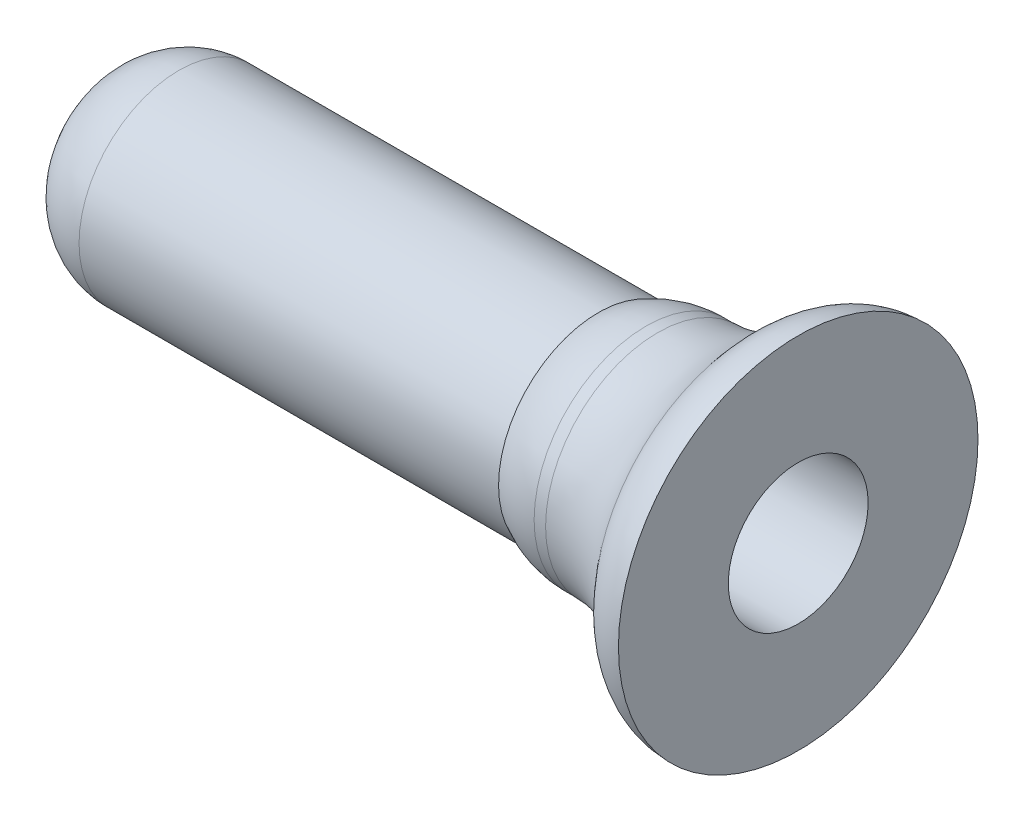
ISO-10303-21;
HEADER;
FILE_DESCRIPTION(('STEP AP214'),'2;1');
FILE_NAME('part.step','',(''),(''),'','','');
FILE_SCHEMA(('AUTOMOTIVE_DESIGN { 1 0 10303 214 1 1 1 1 }'));
ENDSEC;
DATA;
#1=APPLICATION_CONTEXT('core data for automotive mechanical design processes');
#2=APPLICATION_PROTOCOL_DEFINITION('international standard','automotive_design',2000,#1);
#3=PRODUCT_CONTEXT('',#1,'mechanical');
#4=PRODUCT('Part','Part','',(#3));
#5=PRODUCT_RELATED_PRODUCT_CATEGORY('part','',(#4));
#6=PRODUCT_DEFINITION_FORMATION('','',#4);
#7=PRODUCT_DEFINITION_CONTEXT('part definition',#1,'design');
#8=PRODUCT_DEFINITION('design','',#6,#7);
#9=PRODUCT_DEFINITION_SHAPE('','',#8);
#10=(LENGTH_UNIT() NAMED_UNIT(*) SI_UNIT(.MILLI.,.METRE.));
#11=(NAMED_UNIT(*) PLANE_ANGLE_UNIT() SI_UNIT($,.RADIAN.));
#12=(NAMED_UNIT(*) SI_UNIT($,.STERADIAN.) SOLID_ANGLE_UNIT());
#13=UNCERTAINTY_MEASURE_WITH_UNIT(LENGTH_MEASURE(1.E-05),#10,'distance_accuracy_value','');
#14=(GEOMETRIC_REPRESENTATION_CONTEXT(3) GLOBAL_UNCERTAINTY_ASSIGNED_CONTEXT((#13)) GLOBAL_UNIT_ASSIGNED_CONTEXT((#10,
#11,#12)) REPRESENTATION_CONTEXT('',''));
#15=CARTESIAN_POINT('',(0.,0.,0.));
#16=DIRECTION('',(0.,0.,1.));
#17=DIRECTION('',(1.,0.,0.));
#18=AXIS2_PLACEMENT_3D('',#15,#16,#17);
#19=CARTESIAN_POINT('',(0.,0.,0.));
#20=DIRECTION('',(-1.,0.,0.));
#21=DIRECTION('',(0.,0.,1.));
#22=AXIS2_PLACEMENT_3D('',#19,#20,#21);
#23=PLANE('',#22);
#24=CARTESIAN_POINT('',(0.,0.,0.));
#25=DIRECTION('',(1.,0.,0.));
#26=DIRECTION('',(0.,0.,-1.));
#27=AXIS2_PLACEMENT_3D('',#24,#25,#26);
#28=CIRCLE('',#27,3.5);
#29=CARTESIAN_POINT('',(0.,0.,-3.5));
#30=VERTEX_POINT('',#29);
#31=EDGE_CURVE('E73',#30,#30,#28,.T.);
#32=ORIENTED_EDGE('',*,*,#31,.F.);
#33=EDGE_LOOP('',(#32));
#34=FACE_BOUND('',#33,.T.);
#35=CARTESIAN_POINT('',(0.,0.,0.));
#36=DIRECTION('',(-1.,0.,0.));
#37=DIRECTION('',(0.,0.,1.));
#38=AXIS2_PLACEMENT_3D('',#35,#36,#37);
#39=CIRCLE('',#38,9.);
#40=CARTESIAN_POINT('',(0.,0.,9.));
#41=VERTEX_POINT('',#40);
#42=EDGE_CURVE('E66',#41,#41,#39,.T.);
#43=ORIENTED_EDGE('',*,*,#42,.F.);
#44=EDGE_LOOP('',(#43));
#45=FACE_BOUND('',#44,.T.);
#46=ADVANCED_FACE('F43',(#34,#45),#23,.F.);
#47=CARTESIAN_POINT('',(-35.,0.,0.));
#48=DIRECTION('',(-1.,0.,0.));
#49=DIRECTION('',(0.,0.,1.));
#50=AXIS2_PLACEMENT_3D('',#47,#48,#49);
#51=CYLINDRICAL_SURFACE('',#50,5.60541789004276);
#52=CARTESIAN_POINT('',(-7.61512095089839,0.,0.));
#53=DIRECTION('',(-1.,0.,0.));
#54=DIRECTION('',(0.,0.,1.));
#55=AXIS2_PLACEMENT_3D('',#52,#53,#54);
#56=CIRCLE('',#55,5.60541789004276);
#57=CARTESIAN_POINT('',(-7.61512095089839,0.,5.60541789004276));
#58=VERTEX_POINT('',#57);
#59=EDGE_CURVE('E54',#58,#58,#56,.F.);
#60=ORIENTED_EDGE('',*,*,#59,.T.);
#61=EDGE_LOOP('',(#60));
#62=FACE_BOUND('',#61,.T.);
#63=CARTESIAN_POINT('',(-7.04125629969457,0.,0.));
#64=DIRECTION('',(-1.,0.,0.));
#65=DIRECTION('',(0.,0.,1.));
#66=AXIS2_PLACEMENT_3D('',#63,#64,#65);
#67=CIRCLE('',#66,5.60541789004276);
#68=CARTESIAN_POINT('',(-7.04125629969457,0.,5.60541789004276));
#69=VERTEX_POINT('',#68);
#70=EDGE_CURVE('E63',#69,#69,#67,.T.);
#71=ORIENTED_EDGE('',*,*,#70,.T.);
#72=EDGE_LOOP('',(#71));
#73=FACE_BOUND('',#72,.T.);
#74=ADVANCED_FACE('F90',(#62,#73),#51,.T.);
#75=CARTESIAN_POINT('',(-35.,0.,0.));
#76=DIRECTION('',(-1.,0.,0.));
#77=DIRECTION('',(0.,0.,1.));
#78=AXIS2_PLACEMENT_3D('',#75,#76,#77);
#79=CYLINDRICAL_SURFACE('',#78,5.);
#80=CARTESIAN_POINT('',(-31.,0.,0.));
#81=DIRECTION('',(1.,0.,0.));
#82=DIRECTION('',(0.,0.,-1.));
#83=AXIS2_PLACEMENT_3D('',#80,#81,#82);
#84=CIRCLE('',#83,5.);
#85=CARTESIAN_POINT('',(-31.,0.,-5.));
#86=VERTEX_POINT('',#85);
#87=EDGE_CURVE('E10',#86,#86,#84,.T.);
#88=ORIENTED_EDGE('',*,*,#87,.T.);
#89=EDGE_LOOP('',(#88));
#90=FACE_BOUND('',#89,.T.);
#91=CARTESIAN_POINT('',(-10.,0.,0.));
#92=DIRECTION('',(-1.,0.,0.));
#93=DIRECTION('',(0.,0.,1.));
#94=AXIS2_PLACEMENT_3D('',#91,#92,#93);
#95=CIRCLE('',#94,5.);
#96=CARTESIAN_POINT('',(-10.,0.,5.));
#97=VERTEX_POINT('',#96);
#98=EDGE_CURVE('E69',#97,#97,#95,.T.);
#99=ORIENTED_EDGE('',*,*,#98,.T.);
#100=EDGE_LOOP('',(#99));
#101=FACE_BOUND('',#100,.T.);
#102=ADVANCED_FACE('F120',(#90,#101),#79,.T.);
#103=CARTESIAN_POINT('',(-35.,0.,-5.));
#104=DIRECTION('',(1.,0.,0.));
#105=DIRECTION('',(0.,0.,-1.));
#106=AXIS2_PLACEMENT_3D('',#103,#104,#105);
#107=PLANE('',#106);
#108=CARTESIAN_POINT('',(-35.,0.,0.));
#109=DIRECTION('',(1.,0.,0.));
#110=DIRECTION('',(0.,0.,-1.));
#111=AXIS2_PLACEMENT_3D('',#108,#109,#110);
#112=CIRCLE('',#111,1.);
#113=CARTESIAN_POINT('',(-35.,0.,-1.));
#114=VERTEX_POINT('',#113);
#115=EDGE_CURVE('E50',#114,#114,#112,.F.);
#116=ORIENTED_EDGE('',*,*,#115,.T.);
#117=EDGE_LOOP('',(#116));
#118=FACE_BOUND('',#117,.T.);
#119=ADVANCED_FACE('F84',(#118),#107,.F.);
#120=CARTESIAN_POINT('',(-10.,0.,0.));
#121=DIRECTION('',(1.,0.,0.));
#122=DIRECTION('',(0.,0.,-1.));
#123=AXIS2_PLACEMENT_3D('',#120,#121,#122);
#124=CYLINDRICAL_SURFACE('',#123,3.5);
#125=CARTESIAN_POINT('',(-10.,0.,0.));
#126=DIRECTION('',(1.,0.,0.));
#127=DIRECTION('',(0.,0.,-1.));
#128=AXIS2_PLACEMENT_3D('',#125,#126,#127);
#129=CIRCLE('',#128,3.5);
#130=CARTESIAN_POINT('',(-10.,0.,-3.5));
#131=VERTEX_POINT('',#130);
#132=EDGE_CURVE('E72',#131,#131,#129,.T.);
#133=ORIENTED_EDGE('',*,*,#132,.F.);
#134=EDGE_LOOP('',(#133));
#135=FACE_BOUND('',#134,.T.);
#136=ORIENTED_EDGE('',*,*,#31,.T.);
#137=EDGE_LOOP('',(#136));
#138=FACE_BOUND('',#137,.T.);
#139=ADVANCED_FACE('F81',(#135,#138),#124,.F.);
#140=CARTESIAN_POINT('',(-10.,0.,0.));
#141=DIRECTION('',(1.,0.,0.));
#142=DIRECTION('',(0.,0.,-1.));
#143=AXIS2_PLACEMENT_3D('',#140,#141,#142);
#144=PLANE('',#143);
#145=ORIENTED_EDGE('',*,*,#132,.T.);
#146=EDGE_LOOP('',(#145));
#147=FACE_BOUND('',#146,.T.);
#148=ADVANCED_FACE('F79',(#147),#144,.T.);
#149=CARTESIAN_POINT('',(0.,0.,0.));
#150=DIRECTION('',(1.,0.,0.));
#151=DIRECTION('',(0.,0.,-1.));
#152=AXIS2_PLACEMENT_3D('',#149,#150,#151);
#153=TOROIDAL_SURFACE('',#152,6.,3.);
#154=CARTESIAN_POINT('',(-2.34708543323153,0.,0.));
#155=DIRECTION('',(1.,0.,0.));
#156=DIRECTION('',(0.,0.,-1.));
#157=AXIS2_PLACEMENT_3D('',#154,#155,#156);
#158=CIRCLE('',#157,7.86847263001426);
#159=CARTESIAN_POINT('',(-2.34708543323153,0.,-7.86847263001426));
#160=VERTEX_POINT('',#159);
#161=EDGE_CURVE('E58',#160,#160,#158,.T.);
#162=ORIENTED_EDGE('',*,*,#161,.T.);
#163=EDGE_LOOP('',(#162));
#164=FACE_BOUND('',#163,.T.);
#165=ORIENTED_EDGE('',*,*,#42,.T.);
#166=EDGE_LOOP('',(#165));
#167=FACE_BOUND('',#166,.T.);
#168=ADVANCED_FACE('F94',(#164,#167),#153,.T.);
#169=CARTESIAN_POINT('',(-7.04125629969457,0.,0.));
#170=DIRECTION('',(-1.,0.,0.));
#171=DIRECTION('',(0.,0.,1.));
#172=AXIS2_PLACEMENT_3D('',#169,#170,#171);
#173=TOROIDAL_SURFACE('',#172,11.6054178900428,6.);
#174=ORIENTED_EDGE('',*,*,#161,.F.);
#175=EDGE_LOOP('',(#174));
#176=FACE_BOUND('',#175,.T.);
#177=ORIENTED_EDGE('',*,*,#70,.F.);
#178=EDGE_LOOP('',(#177));
#179=FACE_BOUND('',#178,.T.);
#180=ADVANCED_FACE('F96',(#176,#179),#173,.F.);
#181=CARTESIAN_POINT('',(-7.61512095089839,0.,0.));
#182=DIRECTION('',(-1.,0.,0.));
#183=DIRECTION('',(0.,0.,1.));
#184=AXIS2_PLACEMENT_3D('',#181,#182,#183);
#185=DEGENERATE_TOROIDAL_SURFACE('',#184,0.605417890042763,5.,.T.);
#186=ORIENTED_EDGE('',*,*,#59,.F.);
#187=EDGE_LOOP('',(#186));
#188=FACE_BOUND('',#187,.T.);
#189=ORIENTED_EDGE('',*,*,#98,.F.);
#190=EDGE_LOOP('',(#189));
#191=FACE_BOUND('',#190,.T.);
#192=ADVANCED_FACE('F103',(#188,#191),#185,.T.);
#193=CARTESIAN_POINT('',(-31.,0.,0.));
#194=DIRECTION('',(1.,0.,0.));
#195=DIRECTION('',(0.,0.,-1.));
#196=AXIS2_PLACEMENT_3D('',#193,#194,#195);
#197=DEGENERATE_TOROIDAL_SURFACE('',#196,1.,4.,.T.);
#198=ORIENTED_EDGE('',*,*,#87,.F.);
#199=EDGE_LOOP('',(#198));
#200=FACE_BOUND('',#199,.T.);
#201=ORIENTED_EDGE('',*,*,#115,.F.);
#202=EDGE_LOOP('',(#201));
#203=FACE_BOUND('',#202,.T.);
#204=ADVANCED_FACE('F45',(#200,#203),#197,.T.);
#205=CLOSED_SHELL('',(#46,#74,#102,#119,#139,#148,#168,#180,#192,#204));
#206=MANIFOLD_SOLID_BREP('B2',#205);
#207=ADVANCED_BREP_SHAPE_REPRESENTATION('',(#18,#206),#14);
#208=SHAPE_DEFINITION_REPRESENTATION(#9,#207);
ENDSEC;
END-ISO-10303-21;
